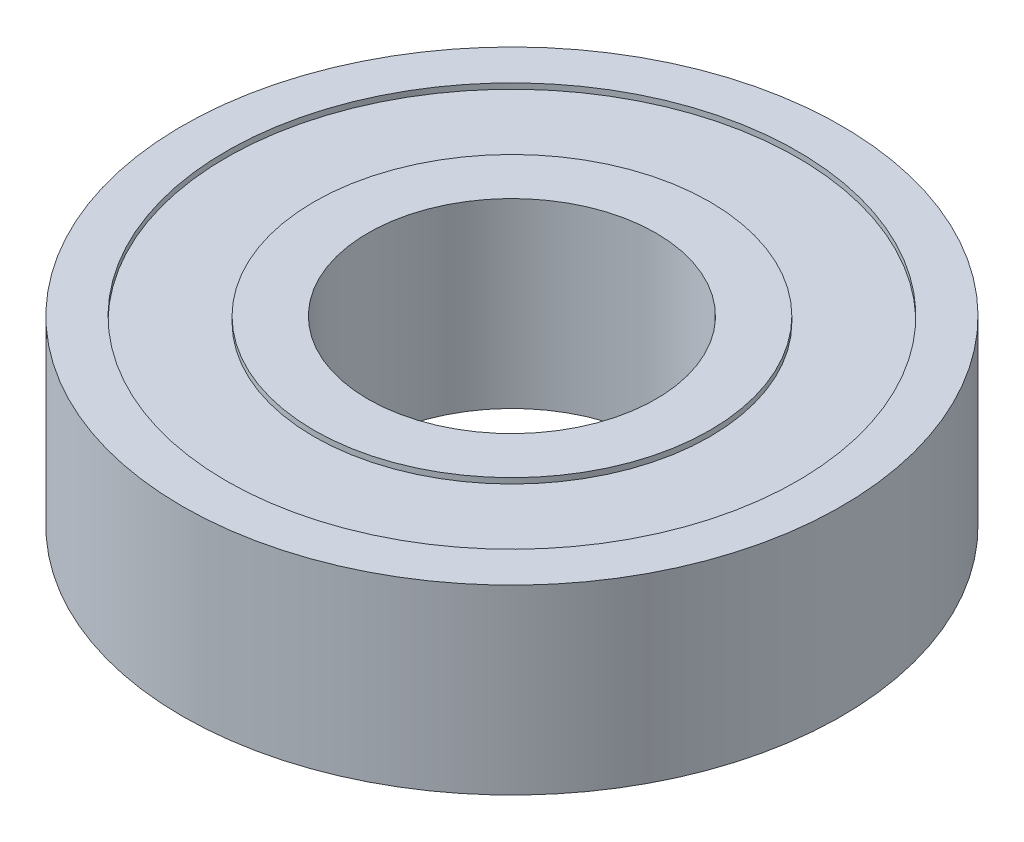
ISO-10303-21;
HEADER;
FILE_DESCRIPTION(('STEP AP214'),'2;1');
FILE_NAME('part.step','',(''),(''),'','','');
FILE_SCHEMA(('AUTOMOTIVE_DESIGN { 1 0 10303 214 1 1 1 1 }'));
ENDSEC;
DATA;
#1=APPLICATION_CONTEXT('core data for automotive mechanical design processes');
#2=APPLICATION_PROTOCOL_DEFINITION('international standard','automotive_design',2000,#1);
#3=PRODUCT_CONTEXT('',#1,'mechanical');
#4=PRODUCT('Part','Part','',(#3));
#5=PRODUCT_RELATED_PRODUCT_CATEGORY('part','',(#4));
#6=PRODUCT_DEFINITION_FORMATION('','',#4);
#7=PRODUCT_DEFINITION_CONTEXT('part definition',#1,'design');
#8=PRODUCT_DEFINITION('design','',#6,#7);
#9=PRODUCT_DEFINITION_SHAPE('','',#8);
#10=(LENGTH_UNIT() NAMED_UNIT(*) SI_UNIT(.MILLI.,.METRE.));
#11=(NAMED_UNIT(*) PLANE_ANGLE_UNIT() SI_UNIT($,.RADIAN.));
#12=(NAMED_UNIT(*) SI_UNIT($,.STERADIAN.) SOLID_ANGLE_UNIT());
#13=UNCERTAINTY_MEASURE_WITH_UNIT(LENGTH_MEASURE(1.E-05),#10,'distance_accuracy_value','');
#14=(GEOMETRIC_REPRESENTATION_CONTEXT(3) GLOBAL_UNCERTAINTY_ASSIGNED_CONTEXT((#13)) GLOBAL_UNIT_ASSIGNED_CONTEXT((#10,
#11,#12)) REPRESENTATION_CONTEXT('',''));
#15=CARTESIAN_POINT('',(0.,0.,0.));
#16=DIRECTION('',(0.,0.,1.));
#17=DIRECTION('',(1.,0.,0.));
#18=AXIS2_PLACEMENT_3D('',#15,#16,#17);
#19=CARTESIAN_POINT('',(-2.48953957780104,0.,0.));
#20=DIRECTION('',(0.,1.,0.));
#21=DIRECTION('',(0.,0.,1.));
#22=AXIS2_PLACEMENT_3D('',#19,#20,#21);
#23=PLANE('',#22);
#24=CARTESIAN_POINT('',(-2.48953957780104,0.,0.));
#25=DIRECTION('',(0.,1.,0.));
#26=DIRECTION('',(0.,0.,1.));
#27=AXIS2_PLACEMENT_3D('',#24,#25,#26);
#28=CIRCLE('',#27,6.255);
#29=CARTESIAN_POINT('',(-2.48953957780104,0.,6.255));
#30=VERTEX_POINT('',#29);
#31=EDGE_CURVE('E53',#30,#30,#28,.T.);
#32=ORIENTED_EDGE('',*,*,#31,.T.);
#33=EDGE_LOOP('',(#32));
#34=FACE_BOUND('',#33,.T.);
#35=CARTESIAN_POINT('',(-2.48953957780104,0.,0.));
#36=DIRECTION('',(0.,1.,0.));
#37=DIRECTION('',(0.,0.,1.));
#38=AXIS2_PLACEMENT_3D('',#35,#36,#37);
#39=CIRCLE('',#38,8.6);
#40=CARTESIAN_POINT('',(-2.48953957780104,0.,8.6));
#41=VERTEX_POINT('',#40);
#42=EDGE_CURVE('E79',#41,#41,#39,.T.);
#43=ORIENTED_EDGE('',*,*,#42,.F.);
#44=EDGE_LOOP('',(#43));
#45=FACE_BOUND('',#44,.T.);
#46=ADVANCED_FACE('F42',(#34,#45),#23,.F.);
#47=CARTESIAN_POINT('',(-2.48953957780104,7.9,0.));
#48=DIRECTION('',(0.,1.,0.));
#49=DIRECTION('',(0.,0.,1.));
#50=AXIS2_PLACEMENT_3D('',#47,#48,#49);
#51=PLANE('',#50);
#52=CARTESIAN_POINT('',(-2.48953957780104,7.9,0.));
#53=DIRECTION('',(0.,1.,0.));
#54=DIRECTION('',(0.,0.,1.));
#55=AXIS2_PLACEMENT_3D('',#52,#53,#54);
#56=CIRCLE('',#55,6.255);
#57=CARTESIAN_POINT('',(-2.48953957780104,7.9,6.255));
#58=VERTEX_POINT('',#57);
#59=EDGE_CURVE('E55',#58,#58,#56,.T.);
#60=ORIENTED_EDGE('',*,*,#59,.F.);
#61=EDGE_LOOP('',(#60));
#62=FACE_BOUND('',#61,.T.);
#63=CARTESIAN_POINT('',(-2.48953957780104,7.9,0.));
#64=DIRECTION('',(0.,1.,0.));
#65=DIRECTION('',(0.,0.,1.));
#66=AXIS2_PLACEMENT_3D('',#63,#64,#65);
#67=CIRCLE('',#66,8.6);
#68=CARTESIAN_POINT('',(-2.48953957780104,7.9,8.6));
#69=VERTEX_POINT('',#68);
#70=EDGE_CURVE('E67',#69,#69,#67,.T.);
#71=ORIENTED_EDGE('',*,*,#70,.T.);
#72=EDGE_LOOP('',(#71));
#73=FACE_BOUND('',#72,.T.);
#74=ADVANCED_FACE('F95',(#62,#73),#51,.T.);
#75=CARTESIAN_POINT('',(-2.48953957780104,7.9,0.));
#76=DIRECTION('',(0.,-1.,0.));
#77=DIRECTION('',(0.,0.,-1.));
#78=AXIS2_PLACEMENT_3D('',#75,#76,#77);
#79=CYLINDRICAL_SURFACE('',#78,14.32);
#80=CARTESIAN_POINT('',(-2.48953957780104,7.9,0.));
#81=DIRECTION('',(0.,1.,0.));
#82=DIRECTION('',(0.,0.,1.));
#83=AXIS2_PLACEMENT_3D('',#80,#81,#82);
#84=CIRCLE('',#83,14.32);
#85=CARTESIAN_POINT('',(-2.48953957780104,7.9,14.32));
#86=VERTEX_POINT('',#85);
#87=EDGE_CURVE('E10',#86,#86,#84,.T.);
#88=ORIENTED_EDGE('',*,*,#87,.F.);
#89=EDGE_LOOP('',(#88));
#90=FACE_BOUND('',#89,.T.);
#91=CARTESIAN_POINT('',(-2.48953957780104,0.,0.));
#92=DIRECTION('',(0.,1.,0.));
#93=DIRECTION('',(0.,0.,1.));
#94=AXIS2_PLACEMENT_3D('',#91,#92,#93);
#95=CIRCLE('',#94,14.32);
#96=CARTESIAN_POINT('',(-2.48953957780104,0.,14.32));
#97=VERTEX_POINT('',#96);
#98=EDGE_CURVE('E46',#97,#97,#95,.T.);
#99=ORIENTED_EDGE('',*,*,#98,.T.);
#100=EDGE_LOOP('',(#99));
#101=FACE_BOUND('',#100,.T.);
#102=ADVANCED_FACE('F44',(#90,#101),#79,.T.);
#103=CARTESIAN_POINT('',(-2.48953957780104,7.9,0.));
#104=DIRECTION('',(0.,1.,0.));
#105=DIRECTION('',(0.,0.,1.));
#106=AXIS2_PLACEMENT_3D('',#103,#104,#105);
#107=CIRCLE('',#106,12.41);
#108=CARTESIAN_POINT('',(-2.48953957780104,7.9,12.41));
#109=VERTEX_POINT('',#108);
#110=EDGE_CURVE('E61',#109,#109,#107,.T.);
#111=ORIENTED_EDGE('',*,*,#110,.F.);
#112=EDGE_LOOP('',(#111));
#113=FACE_BOUND('',#112,.T.);
#114=ORIENTED_EDGE('',*,*,#87,.T.);
#115=EDGE_LOOP('',(#114));
#116=FACE_BOUND('',#115,.T.);
#117=ADVANCED_FACE('F102',(#113,#116),#51,.T.);
#118=CARTESIAN_POINT('',(-2.48953957780104,0.,0.));
#119=DIRECTION('',(0.,1.,0.));
#120=DIRECTION('',(0.,0.,1.));
#121=AXIS2_PLACEMENT_3D('',#118,#119,#120);
#122=CIRCLE('',#121,12.41);
#123=CARTESIAN_POINT('',(-2.48953957780104,0.,12.41));
#124=VERTEX_POINT('',#123);
#125=EDGE_CURVE('E73',#124,#124,#122,.T.);
#126=ORIENTED_EDGE('',*,*,#125,.T.);
#127=EDGE_LOOP('',(#126));
#128=FACE_BOUND('',#127,.T.);
#129=ORIENTED_EDGE('',*,*,#98,.F.);
#130=EDGE_LOOP('',(#129));
#131=FACE_BOUND('',#130,.T.);
#132=ADVANCED_FACE('F97',(#128,#131),#23,.F.);
#133=CARTESIAN_POINT('',(-2.48953957780104,0.,0.));
#134=DIRECTION('',(0.,1.,0.));
#135=DIRECTION('',(0.,0.,1.));
#136=AXIS2_PLACEMENT_3D('',#133,#134,#135);
#137=CYLINDRICAL_SURFACE('',#136,6.255);
#138=ORIENTED_EDGE('',*,*,#31,.F.);
#139=EDGE_LOOP('',(#138));
#140=FACE_BOUND('',#139,.T.);
#141=ORIENTED_EDGE('',*,*,#59,.T.);
#142=EDGE_LOOP('',(#141));
#143=FACE_BOUND('',#142,.T.);
#144=ADVANCED_FACE('F104',(#140,#143),#137,.F.);
#145=CARTESIAN_POINT('',(-2.48953957780104,7.66,0.));
#146=DIRECTION('',(0.,1.,0.));
#147=DIRECTION('',(0.,0.,1.));
#148=AXIS2_PLACEMENT_3D('',#145,#146,#147);
#149=CYLINDRICAL_SURFACE('',#148,12.41);
#150=CARTESIAN_POINT('',(-2.48953957780104,7.66,0.));
#151=DIRECTION('',(0.,1.,0.));
#152=DIRECTION('',(0.,0.,1.));
#153=AXIS2_PLACEMENT_3D('',#150,#151,#152);
#154=CIRCLE('',#153,12.41);
#155=CARTESIAN_POINT('',(-2.48953957780104,7.66,12.41));
#156=VERTEX_POINT('',#155);
#157=EDGE_CURVE('E58',#156,#156,#154,.T.);
#158=ORIENTED_EDGE('',*,*,#157,.F.);
#159=EDGE_LOOP('',(#158));
#160=FACE_BOUND('',#159,.T.);
#161=ORIENTED_EDGE('',*,*,#110,.T.);
#162=EDGE_LOOP('',(#161));
#163=FACE_BOUND('',#162,.T.);
#164=ADVANCED_FACE('F109',(#160,#163),#149,.F.);
#165=CARTESIAN_POINT('',(-2.48953957780104,7.66,0.));
#166=DIRECTION('',(0.,1.,0.));
#167=DIRECTION('',(0.,0.,1.));
#168=AXIS2_PLACEMENT_3D('',#165,#166,#167);
#169=PLANE('',#168);
#170=CARTESIAN_POINT('',(-2.48953957780104,7.66,0.));
#171=DIRECTION('',(0.,1.,0.));
#172=DIRECTION('',(0.,0.,1.));
#173=AXIS2_PLACEMENT_3D('',#170,#171,#172);
#174=CIRCLE('',#173,8.6);
#175=CARTESIAN_POINT('',(-2.48953957780104,7.66,8.6));
#176=VERTEX_POINT('',#175);
#177=EDGE_CURVE('E64',#176,#176,#174,.T.);
#178=ORIENTED_EDGE('',*,*,#177,.F.);
#179=EDGE_LOOP('',(#178));
#180=FACE_BOUND('',#179,.T.);
#181=ORIENTED_EDGE('',*,*,#157,.T.);
#182=EDGE_LOOP('',(#181));
#183=FACE_BOUND('',#182,.T.);
#184=ADVANCED_FACE('F135',(#180,#183),#169,.T.);
#185=CARTESIAN_POINT('',(-2.48953957780104,7.66,0.));
#186=DIRECTION('',(0.,1.,0.));
#187=DIRECTION('',(0.,0.,1.));
#188=AXIS2_PLACEMENT_3D('',#185,#186,#187);
#189=CYLINDRICAL_SURFACE('',#188,8.6);
#190=ORIENTED_EDGE('',*,*,#177,.T.);
#191=EDGE_LOOP('',(#190));
#192=FACE_BOUND('',#191,.T.);
#193=ORIENTED_EDGE('',*,*,#70,.F.);
#194=EDGE_LOOP('',(#193));
#195=FACE_BOUND('',#194,.T.);
#196=ADVANCED_FACE('F144',(#192,#195),#189,.T.);
#197=CARTESIAN_POINT('',(-2.48953957780104,0.24,0.));
#198=DIRECTION('',(0.,-1.,0.));
#199=DIRECTION('',(0.,0.,1.));
#200=AXIS2_PLACEMENT_3D('',#197,#198,#199);
#201=PLANE('',#200);
#202=CARTESIAN_POINT('',(-2.48953957780104,0.24,0.));
#203=DIRECTION('',(0.,1.,0.));
#204=DIRECTION('',(0.,0.,1.));
#205=AXIS2_PLACEMENT_3D('',#202,#203,#204);
#206=CIRCLE('',#205,12.41);
#207=CARTESIAN_POINT('',(-2.48953957780104,0.24,12.41));
#208=VERTEX_POINT('',#207);
#209=EDGE_CURVE('E70',#208,#208,#206,.T.);
#210=ORIENTED_EDGE('',*,*,#209,.F.);
#211=EDGE_LOOP('',(#210));
#212=FACE_BOUND('',#211,.T.);
#213=CARTESIAN_POINT('',(-2.48953957780104,0.24,0.));
#214=DIRECTION('',(0.,1.,0.));
#215=DIRECTION('',(0.,0.,1.));
#216=AXIS2_PLACEMENT_3D('',#213,#214,#215);
#217=CIRCLE('',#216,8.6);
#218=CARTESIAN_POINT('',(-2.48953957780104,0.24,8.6));
#219=VERTEX_POINT('',#218);
#220=EDGE_CURVE('E76',#219,#219,#217,.T.);
#221=ORIENTED_EDGE('',*,*,#220,.T.);
#222=EDGE_LOOP('',(#221));
#223=FACE_BOUND('',#222,.T.);
#224=ADVANCED_FACE('F85',(#212,#223),#201,.T.);
#225=CARTESIAN_POINT('',(-2.48953957780104,0.24,0.));
#226=DIRECTION('',(0.,-1.,0.));
#227=DIRECTION('',(0.,0.,-1.));
#228=AXIS2_PLACEMENT_3D('',#225,#226,#227);
#229=CYLINDRICAL_SURFACE('',#228,12.41);
#230=ORIENTED_EDGE('',*,*,#209,.T.);
#231=EDGE_LOOP('',(#230));
#232=FACE_BOUND('',#231,.T.);
#233=ORIENTED_EDGE('',*,*,#125,.F.);
#234=EDGE_LOOP('',(#233));
#235=FACE_BOUND('',#234,.T.);
#236=ADVANCED_FACE('F90',(#232,#235),#229,.F.);
#237=CARTESIAN_POINT('',(-2.48953957780104,0.24,0.));
#238=DIRECTION('',(0.,-1.,0.));
#239=DIRECTION('',(0.,0.,-1.));
#240=AXIS2_PLACEMENT_3D('',#237,#238,#239);
#241=CYLINDRICAL_SURFACE('',#240,8.6);
#242=ORIENTED_EDGE('',*,*,#220,.F.);
#243=EDGE_LOOP('',(#242));
#244=FACE_BOUND('',#243,.T.);
#245=ORIENTED_EDGE('',*,*,#42,.T.);
#246=EDGE_LOOP('',(#245));
#247=FACE_BOUND('',#246,.T.);
#248=ADVANCED_FACE('F87',(#244,#247),#241,.T.);
#249=CLOSED_SHELL('',(#46,#74,#102,#117,#132,#144,#164,#184,#196,#224,#236,#248));
#250=MANIFOLD_SOLID_BREP('B2',#249);
#251=ADVANCED_BREP_SHAPE_REPRESENTATION('',(#18,#250),#14);
#252=SHAPE_DEFINITION_REPRESENTATION(#9,#251);
ENDSEC;
END-ISO-10303-21;
